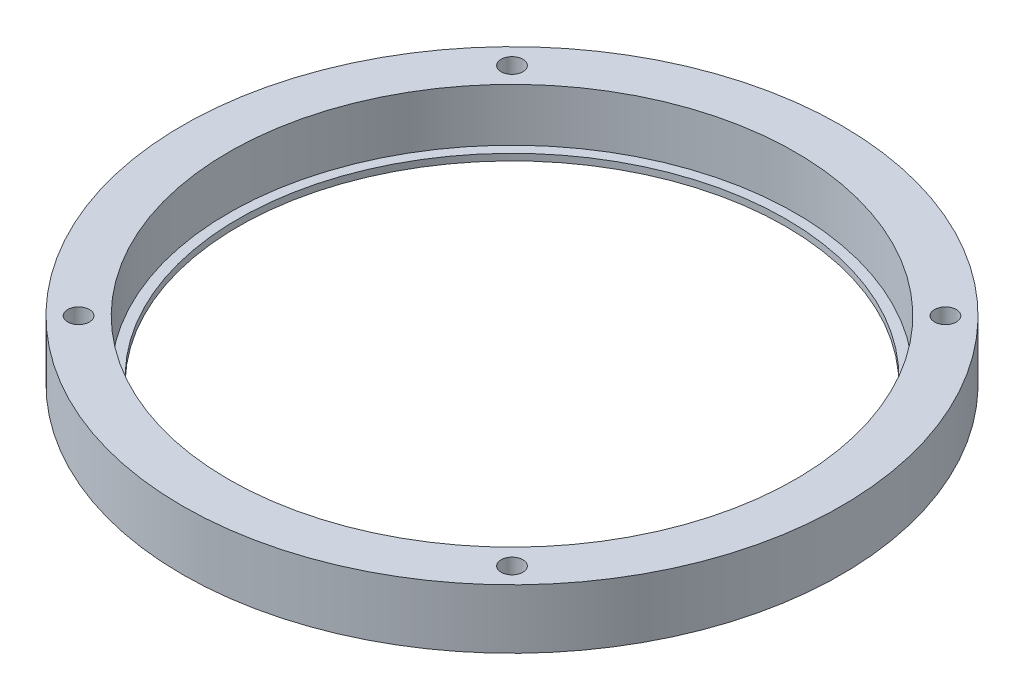
ISO-10303-21;
HEADER;
FILE_DESCRIPTION(('STEP AP214'),'2;1');
FILE_NAME('part.step','',(''),(''),'','','');
FILE_SCHEMA(('AUTOMOTIVE_DESIGN { 1 0 10303 214 1 1 1 1 }'));
ENDSEC;
DATA;
#1=APPLICATION_CONTEXT('core data for automotive mechanical design processes');
#2=APPLICATION_PROTOCOL_DEFINITION('international standard','automotive_design',2000,#1);
#3=PRODUCT_CONTEXT('',#1,'mechanical');
#4=PRODUCT('Part','Part','',(#3));
#5=PRODUCT_RELATED_PRODUCT_CATEGORY('part','',(#4));
#6=PRODUCT_DEFINITION_FORMATION('','',#4);
#7=PRODUCT_DEFINITION_CONTEXT('part definition',#1,'design');
#8=PRODUCT_DEFINITION('design','',#6,#7);
#9=PRODUCT_DEFINITION_SHAPE('','',#8);
#10=(LENGTH_UNIT() NAMED_UNIT(*) SI_UNIT(.MILLI.,.METRE.));
#11=(NAMED_UNIT(*) PLANE_ANGLE_UNIT() SI_UNIT($,.RADIAN.));
#12=(NAMED_UNIT(*) SI_UNIT($,.STERADIAN.) SOLID_ANGLE_UNIT());
#13=UNCERTAINTY_MEASURE_WITH_UNIT(LENGTH_MEASURE(1.E-05),#10,'distance_accuracy_value','');
#14=(GEOMETRIC_REPRESENTATION_CONTEXT(3) GLOBAL_UNCERTAINTY_ASSIGNED_CONTEXT((#13)) GLOBAL_UNIT_ASSIGNED_CONTEXT((#10,
#11,#12)) REPRESENTATION_CONTEXT('',''));
#15=CARTESIAN_POINT('',(0.,0.,0.));
#16=DIRECTION('',(0.,0.,1.));
#17=DIRECTION('',(1.,0.,0.));
#18=AXIS2_PLACEMENT_3D('',#15,#16,#17);
#19=CARTESIAN_POINT('',(0.,8.,0.));
#20=DIRECTION('',(0.,1.,0.));
#21=DIRECTION('',(0.,0.,1.));
#22=AXIS2_PLACEMENT_3D('',#19,#20,#21);
#23=PLANE('',#22);
#24=CARTESIAN_POINT('',(-32.8804653251745,8.,-32.8804653251745));
#25=DIRECTION('',(0.,1.,0.));
#26=DIRECTION('',(0.,0.,1.));
#27=AXIS2_PLACEMENT_3D('',#24,#25,#26);
#28=CIRCLE('',#27,1.64999999999999);
#29=CARTESIAN_POINT('',(-32.8804653251745,8.,-31.2304653251745));
#30=VERTEX_POINT('',#29);
#31=EDGE_CURVE('E84',#30,#30,#28,.T.);
#32=ORIENTED_EDGE('',*,*,#31,.F.);
#33=EDGE_LOOP('',(#32));
#34=FACE_BOUND('',#33,.T.);
#35=CARTESIAN_POINT('',(-32.8804653251745,8.,32.8804653251745));
#36=DIRECTION('',(0.,1.,0.));
#37=DIRECTION('',(0.,0.,1.));
#38=AXIS2_PLACEMENT_3D('',#35,#36,#37);
#39=CIRCLE('',#38,1.64999999999999);
#40=CARTESIAN_POINT('',(-32.8804653251745,8.,34.5304653251745));
#41=VERTEX_POINT('',#40);
#42=EDGE_CURVE('E78',#41,#41,#39,.T.);
#43=ORIENTED_EDGE('',*,*,#42,.F.);
#44=EDGE_LOOP('',(#43));
#45=FACE_BOUND('',#44,.T.);
#46=CARTESIAN_POINT('',(32.8804653251745,8.,32.8804653251745));
#47=DIRECTION('',(0.,1.,0.));
#48=DIRECTION('',(0.,0.,1.));
#49=AXIS2_PLACEMENT_3D('',#46,#47,#48);
#50=CIRCLE('',#49,1.64999999999999);
#51=CARTESIAN_POINT('',(32.8804653251745,8.,34.5304653251745));
#52=VERTEX_POINT('',#51);
#53=EDGE_CURVE('E72',#52,#52,#50,.T.);
#54=ORIENTED_EDGE('',*,*,#53,.F.);
#55=EDGE_LOOP('',(#54));
#56=FACE_BOUND('',#55,.T.);
#57=CARTESIAN_POINT('',(32.8804653251745,8.,-32.8804653251745));
#58=DIRECTION('',(0.,1.,0.));
#59=DIRECTION('',(0.,0.,1.));
#60=AXIS2_PLACEMENT_3D('',#57,#58,#59);
#61=CIRCLE('',#60,1.64999999999999);
#62=CARTESIAN_POINT('',(32.8804653251745,8.,-31.2304653251745));
#63=VERTEX_POINT('',#62);
#64=EDGE_CURVE('E66',#63,#63,#61,.T.);
#65=ORIENTED_EDGE('',*,*,#64,.F.);
#66=EDGE_LOOP('',(#65));
#67=FACE_BOUND('',#66,.T.);
#68=CARTESIAN_POINT('',(0.,8.,0.));
#69=DIRECTION('',(0.,1.,0.));
#70=DIRECTION('',(0.,0.,1.));
#71=AXIS2_PLACEMENT_3D('',#68,#69,#70);
#72=CIRCLE('',#71,50.);
#73=CARTESIAN_POINT('',(0.,8.,50.));
#74=VERTEX_POINT('',#73);
#75=EDGE_CURVE('E10',#74,#74,#72,.T.);
#76=ORIENTED_EDGE('',*,*,#75,.T.);
#77=EDGE_LOOP('',(#76));
#78=FACE_BOUND('',#77,.T.);
#79=CARTESIAN_POINT('',(0.,8.,0.));
#80=DIRECTION('',(0.,1.,0.));
#81=DIRECTION('',(0.,0.,1.));
#82=AXIS2_PLACEMENT_3D('',#79,#80,#81);
#83=CIRCLE('',#82,43.);
#84=CARTESIAN_POINT('',(0.,8.,43.));
#85=VERTEX_POINT('',#84);
#86=EDGE_CURVE('E44',#85,#85,#83,.T.);
#87=ORIENTED_EDGE('',*,*,#86,.F.);
#88=EDGE_LOOP('',(#87));
#89=FACE_BOUND('',#88,.T.);
#90=ADVANCED_FACE('F37',(#34,#45,#56,#67,#78,#89),#23,.T.);
#91=CARTESIAN_POINT('',(0.,8.,0.));
#92=DIRECTION('',(0.,-1.,0.));
#93=DIRECTION('',(0.,0.,-1.));
#94=AXIS2_PLACEMENT_3D('',#91,#92,#93);
#95=CYLINDRICAL_SURFACE('',#94,50.);
#96=ORIENTED_EDGE('',*,*,#75,.F.);
#97=EDGE_LOOP('',(#96));
#98=FACE_BOUND('',#97,.T.);
#99=CARTESIAN_POINT('',(0.,-1.,0.));
#100=DIRECTION('',(0.,-1.,0.));
#101=DIRECTION('',(0.,0.,-1.));
#102=AXIS2_PLACEMENT_3D('',#99,#100,#101);
#103=CIRCLE('',#102,50.);
#104=CARTESIAN_POINT('',(0.,-1.,-50.));
#105=VERTEX_POINT('',#104);
#106=EDGE_CURVE('E53',#105,#105,#103,.T.);
#107=ORIENTED_EDGE('',*,*,#106,.F.);
#108=EDGE_LOOP('',(#107));
#109=FACE_BOUND('',#108,.T.);
#110=ADVANCED_FACE('F39',(#98,#109),#95,.T.);
#111=CARTESIAN_POINT('',(0.,8.,0.));
#112=DIRECTION('',(0.,-1.,0.));
#113=DIRECTION('',(0.,0.,-1.));
#114=AXIS2_PLACEMENT_3D('',#111,#112,#113);
#115=CYLINDRICAL_SURFACE('',#114,43.);
#116=ORIENTED_EDGE('',*,*,#86,.T.);
#117=EDGE_LOOP('',(#116));
#118=FACE_BOUND('',#117,.T.);
#119=CARTESIAN_POINT('',(0.,0.,0.));
#120=DIRECTION('',(0.,1.,0.));
#121=DIRECTION('',(0.,0.,1.));
#122=AXIS2_PLACEMENT_3D('',#119,#120,#121);
#123=CIRCLE('',#122,43.);
#124=CARTESIAN_POINT('',(0.,0.,43.));
#125=VERTEX_POINT('',#124);
#126=EDGE_CURVE('E48',#125,#125,#123,.T.);
#127=ORIENTED_EDGE('',*,*,#126,.F.);
#128=EDGE_LOOP('',(#127));
#129=FACE_BOUND('',#128,.T.);
#130=ADVANCED_FACE('F124',(#118,#129),#115,.F.);
#131=CARTESIAN_POINT('',(0.,0.,0.));
#132=DIRECTION('',(0.,-1.,0.));
#133=DIRECTION('',(0.,0.,-1.));
#134=AXIS2_PLACEMENT_3D('',#131,#132,#133);
#135=PLANE('',#134);
#136=CARTESIAN_POINT('',(0.,0.,0.));
#137=DIRECTION('',(0.,-1.,0.));
#138=DIRECTION('',(0.,0.,-1.));
#139=AXIS2_PLACEMENT_3D('',#136,#137,#138);
#140=CIRCLE('',#139,41.5);
#141=CARTESIAN_POINT('',(0.,0.,-41.5));
#142=VERTEX_POINT('',#141);
#143=EDGE_CURVE('E58',#142,#142,#140,.T.);
#144=ORIENTED_EDGE('',*,*,#143,.T.);
#145=EDGE_LOOP('',(#144));
#146=FACE_BOUND('',#145,.T.);
#147=ORIENTED_EDGE('',*,*,#126,.T.);
#148=EDGE_LOOP('',(#147));
#149=FACE_BOUND('',#148,.T.);
#150=ADVANCED_FACE('F120',(#146,#149),#135,.F.);
#151=CARTESIAN_POINT('',(0.,-1.,0.));
#152=DIRECTION('',(0.,-1.,0.));
#153=DIRECTION('',(0.,0.,-1.));
#154=AXIS2_PLACEMENT_3D('',#151,#152,#153);
#155=PLANE('',#154);
#156=CARTESIAN_POINT('',(-32.8804653251745,-1.00000000000001,-32.8804653251745));
#157=DIRECTION('',(0.,1.,0.));
#158=DIRECTION('',(0.,0.,1.));
#159=AXIS2_PLACEMENT_3D('',#156,#157,#158);
#160=CIRCLE('',#159,1.64999999999998);
#161=CARTESIAN_POINT('',(-32.8804653251745,-1.00000000000001,-31.2304653251745));
#162=VERTEX_POINT('',#161);
#163=EDGE_CURVE('E81',#162,#162,#160,.T.);
#164=ORIENTED_EDGE('',*,*,#163,.T.);
#165=EDGE_LOOP('',(#164));
#166=FACE_BOUND('',#165,.T.);
#167=CARTESIAN_POINT('',(-32.8804653251745,-1.00000000000001,32.8804653251745));
#168=DIRECTION('',(0.,1.,0.));
#169=DIRECTION('',(0.,0.,1.));
#170=AXIS2_PLACEMENT_3D('',#167,#168,#169);
#171=CIRCLE('',#170,1.64999999999998);
#172=CARTESIAN_POINT('',(-32.8804653251745,-1.00000000000001,34.5304653251744));
#173=VERTEX_POINT('',#172);
#174=EDGE_CURVE('E75',#173,#173,#171,.T.);
#175=ORIENTED_EDGE('',*,*,#174,.T.);
#176=EDGE_LOOP('',(#175));
#177=FACE_BOUND('',#176,.T.);
#178=CARTESIAN_POINT('',(32.8804653251745,-1.00000000000001,32.8804653251745));
#179=DIRECTION('',(0.,1.,0.));
#180=DIRECTION('',(0.,0.,1.));
#181=AXIS2_PLACEMENT_3D('',#178,#179,#180);
#182=CIRCLE('',#181,1.64999999999998);
#183=CARTESIAN_POINT('',(32.8804653251745,-1.00000000000001,34.5304653251744));
#184=VERTEX_POINT('',#183);
#185=EDGE_CURVE('E69',#184,#184,#182,.T.);
#186=ORIENTED_EDGE('',*,*,#185,.T.);
#187=EDGE_LOOP('',(#186));
#188=FACE_BOUND('',#187,.T.);
#189=CARTESIAN_POINT('',(32.8804653251745,-1.00000000000001,-32.8804653251745));
#190=DIRECTION('',(0.,1.,0.));
#191=DIRECTION('',(0.,0.,1.));
#192=AXIS2_PLACEMENT_3D('',#189,#190,#191);
#193=CIRCLE('',#192,1.64999999999998);
#194=CARTESIAN_POINT('',(32.8804653251745,-1.00000000000001,-31.2304653251745));
#195=VERTEX_POINT('',#194);
#196=EDGE_CURVE('E61',#195,#195,#193,.T.);
#197=ORIENTED_EDGE('',*,*,#196,.T.);
#198=EDGE_LOOP('',(#197));
#199=FACE_BOUND('',#198,.T.);
#200=ORIENTED_EDGE('',*,*,#106,.T.);
#201=EDGE_LOOP('',(#200));
#202=FACE_BOUND('',#201,.T.);
#203=CARTESIAN_POINT('',(0.,-1.,0.));
#204=DIRECTION('',(0.,-1.,0.));
#205=DIRECTION('',(0.,0.,-1.));
#206=AXIS2_PLACEMENT_3D('',#203,#204,#205);
#207=CIRCLE('',#206,41.5);
#208=CARTESIAN_POINT('',(0.,-1.,-41.5));
#209=VERTEX_POINT('',#208);
#210=EDGE_CURVE('E57',#209,#209,#207,.T.);
#211=ORIENTED_EDGE('',*,*,#210,.F.);
#212=EDGE_LOOP('',(#211));
#213=FACE_BOUND('',#212,.T.);
#214=ADVANCED_FACE('F112',(#166,#177,#188,#199,#202,#213),#155,.T.);
#215=CARTESIAN_POINT('',(0.,-1.,0.));
#216=DIRECTION('',(0.,1.,0.));
#217=DIRECTION('',(0.,0.,1.));
#218=AXIS2_PLACEMENT_3D('',#215,#216,#217);
#219=CYLINDRICAL_SURFACE('',#218,41.5);
#220=ORIENTED_EDGE('',*,*,#210,.T.);
#221=EDGE_LOOP('',(#220));
#222=FACE_BOUND('',#221,.T.);
#223=ORIENTED_EDGE('',*,*,#143,.F.);
#224=EDGE_LOOP('',(#223));
#225=FACE_BOUND('',#224,.T.);
#226=ADVANCED_FACE('F102',(#222,#225),#219,.F.);
#227=CARTESIAN_POINT('',(32.8804653251745,8.,-32.8804653251745));
#228=DIRECTION('',(0.,1.,0.));
#229=DIRECTION('',(0.,0.,1.));
#230=AXIS2_PLACEMENT_3D('',#227,#228,#229);
#231=CYLINDRICAL_SURFACE('',#230,1.64999999999999);
#232=ORIENTED_EDGE('',*,*,#196,.F.);
#233=EDGE_LOOP('',(#232));
#234=FACE_BOUND('',#233,.T.);
#235=ORIENTED_EDGE('',*,*,#64,.T.);
#236=EDGE_LOOP('',(#235));
#237=FACE_BOUND('',#236,.T.);
#238=ADVANCED_FACE('F99',(#234,#237),#231,.F.);
#239=CARTESIAN_POINT('',(32.8804653251745,8.,32.8804653251745));
#240=DIRECTION('',(0.,1.,0.));
#241=DIRECTION('',(0.,0.,1.));
#242=AXIS2_PLACEMENT_3D('',#239,#240,#241);
#243=CYLINDRICAL_SURFACE('',#242,1.64999999999999);
#244=ORIENTED_EDGE('',*,*,#185,.F.);
#245=EDGE_LOOP('',(#244));
#246=FACE_BOUND('',#245,.T.);
#247=ORIENTED_EDGE('',*,*,#53,.T.);
#248=EDGE_LOOP('',(#247));
#249=FACE_BOUND('',#248,.T.);
#250=ADVANCED_FACE('F101',(#246,#249),#243,.F.);
#251=CARTESIAN_POINT('',(-32.8804653251745,8.,32.8804653251745));
#252=DIRECTION('',(0.,1.,0.));
#253=DIRECTION('',(0.,0.,1.));
#254=AXIS2_PLACEMENT_3D('',#251,#252,#253);
#255=CYLINDRICAL_SURFACE('',#254,1.64999999999999);
#256=ORIENTED_EDGE('',*,*,#174,.F.);
#257=EDGE_LOOP('',(#256));
#258=FACE_BOUND('',#257,.T.);
#259=ORIENTED_EDGE('',*,*,#42,.T.);
#260=EDGE_LOOP('',(#259));
#261=FACE_BOUND('',#260,.T.);
#262=ADVANCED_FACE('F109',(#258,#261),#255,.F.);
#263=CARTESIAN_POINT('',(-32.8804653251745,8.,-32.8804653251745));
#264=DIRECTION('',(0.,1.,0.));
#265=DIRECTION('',(0.,0.,1.));
#266=AXIS2_PLACEMENT_3D('',#263,#264,#265);
#267=CYLINDRICAL_SURFACE('',#266,1.64999999999999);
#268=ORIENTED_EDGE('',*,*,#163,.F.);
#269=EDGE_LOOP('',(#268));
#270=FACE_BOUND('',#269,.T.);
#271=ORIENTED_EDGE('',*,*,#31,.T.);
#272=EDGE_LOOP('',(#271));
#273=FACE_BOUND('',#272,.T.);
#274=ADVANCED_FACE('F88',(#270,#273),#267,.F.);
#275=CLOSED_SHELL('',(#90,#110,#130,#150,#214,#226,#238,#250,#262,#274));
#276=MANIFOLD_SOLID_BREP('B2',#275);
#277=ADVANCED_BREP_SHAPE_REPRESENTATION('',(#18,#276),#14);
#278=SHAPE_DEFINITION_REPRESENTATION(#9,#277);
ENDSEC;
END-ISO-10303-21;
